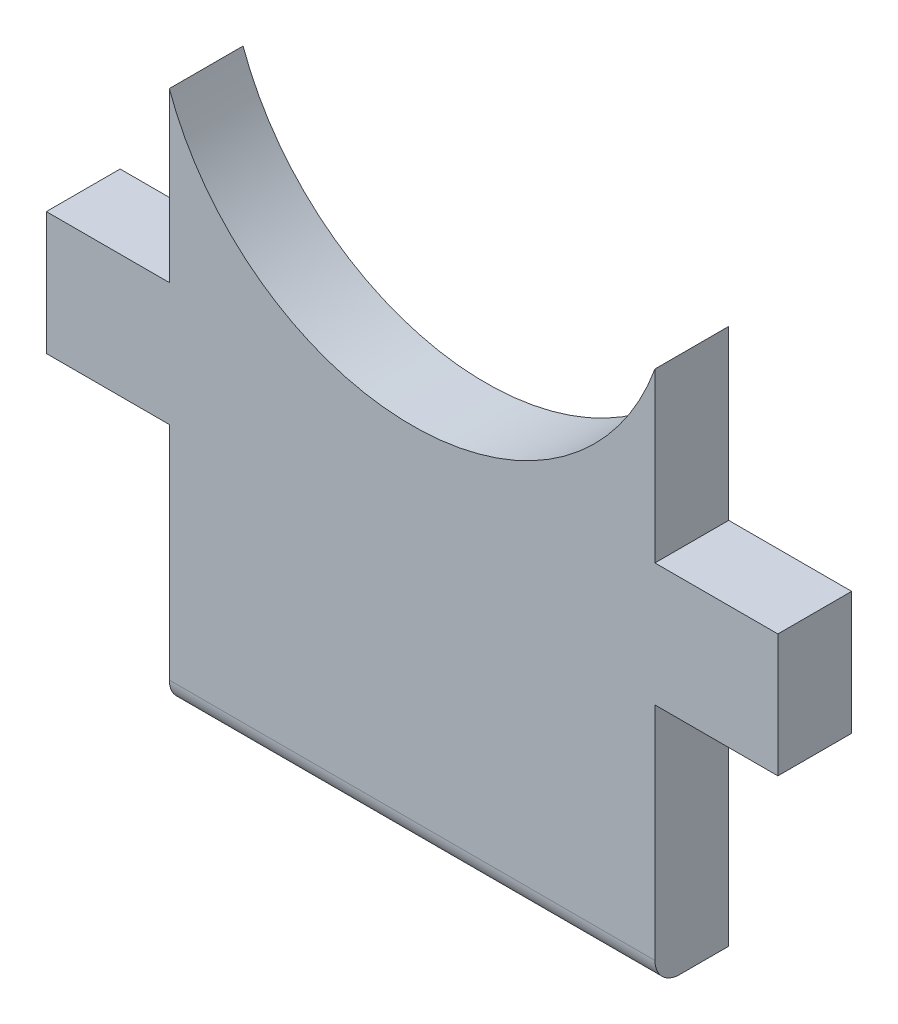
ISO-10303-21;
HEADER;
FILE_DESCRIPTION(('STEP AP214'),'2;1');
FILE_NAME('part.step','',(''),(''),'','','');
FILE_SCHEMA(('AUTOMOTIVE_DESIGN { 1 0 10303 214 1 1 1 1 }'));
ENDSEC;
DATA;
#1=APPLICATION_CONTEXT('core data for automotive mechanical design processes');
#2=APPLICATION_PROTOCOL_DEFINITION('international standard','automotive_design',2000,#1);
#3=PRODUCT_CONTEXT('',#1,'mechanical');
#4=PRODUCT('Part','Part','',(#3));
#5=PRODUCT_RELATED_PRODUCT_CATEGORY('part','',(#4));
#6=PRODUCT_DEFINITION_FORMATION('','',#4);
#7=PRODUCT_DEFINITION_CONTEXT('part definition',#1,'design');
#8=PRODUCT_DEFINITION('design','',#6,#7);
#9=PRODUCT_DEFINITION_SHAPE('','',#8);
#10=(LENGTH_UNIT() NAMED_UNIT(*) SI_UNIT(.MILLI.,.METRE.));
#11=(NAMED_UNIT(*) PLANE_ANGLE_UNIT() SI_UNIT($,.RADIAN.));
#12=(NAMED_UNIT(*) SI_UNIT($,.STERADIAN.) SOLID_ANGLE_UNIT());
#13=UNCERTAINTY_MEASURE_WITH_UNIT(LENGTH_MEASURE(1.E-05),#10,'distance_accuracy_value','');
#14=(GEOMETRIC_REPRESENTATION_CONTEXT(3) GLOBAL_UNCERTAINTY_ASSIGNED_CONTEXT((#13)) GLOBAL_UNIT_ASSIGNED_CONTEXT((#10,
#11,#12)) REPRESENTATION_CONTEXT('',''));
#15=CARTESIAN_POINT('',(0.,0.,0.));
#16=DIRECTION('',(0.,0.,1.));
#17=DIRECTION('',(1.,0.,0.));
#18=AXIS2_PLACEMENT_3D('',#15,#16,#17);
#19=CARTESIAN_POINT('',(-9.875,0.,3.));
#20=DIRECTION('',(1.,0.,0.));
#21=DIRECTION('',(0.,0.,-1.));
#22=AXIS2_PLACEMENT_3D('',#19,#20,#21);
#23=PLANE('',#22);
#24=DIRECTION('',(0.,-1.,0.));
#25=VECTOR('',#24,1.);
#26=CARTESIAN_POINT('',(-9.875,0.,3.));
#27=LINE('',#26,#25);
#28=CARTESIAN_POINT('',(-9.875,-3.56852560590505,3.));
#29=VERTEX_POINT('',#28);
#30=CARTESIAN_POINT('',(-9.875,-10.4,3.));
#31=VERTEX_POINT('',#30);
#32=EDGE_CURVE('E153',#29,#31,#27,.T.);
#33=ORIENTED_EDGE('',*,*,#32,.F.);
#34=DIRECTION('',(0.,0.,1.));
#35=VECTOR('',#34,1.);
#36=CARTESIAN_POINT('',(-9.875,-3.56852560590505,-7.));
#37=LINE('',#36,#35);
#38=CARTESIAN_POINT('',(-9.875,-3.56852560590505,0.));
#39=VERTEX_POINT('',#38);
#40=EDGE_CURVE('E140',#29,#39,#37,.F.);
#41=ORIENTED_EDGE('',*,*,#40,.T.);
#42=DIRECTION('',(0.,-1.,0.));
#43=VECTOR('',#42,1.);
#44=CARTESIAN_POINT('',(-9.875,0.,0.));
#45=LINE('',#44,#43);
#46=CARTESIAN_POINT('',(-9.875,-10.4,0.));
#47=VERTEX_POINT('',#46);
#48=EDGE_CURVE('E148',#39,#47,#45,.T.);
#49=ORIENTED_EDGE('',*,*,#48,.T.);
#50=DIRECTION('',(0.,0.,-1.));
#51=VECTOR('',#50,1.);
#52=CARTESIAN_POINT('',(-9.875,-10.4,3.));
#53=LINE('',#52,#51);
#54=EDGE_CURVE('E161',#31,#47,#53,.T.);
#55=ORIENTED_EDGE('',*,*,#54,.F.);
#56=EDGE_LOOP('',(#33,#41,#49,#55));
#57=FACE_BOUND('',#56,.T.);
#58=ADVANCED_FACE('F46',(#57),#23,.F.);
#59=CARTESIAN_POINT('',(0.,-10.4,3.));
#60=DIRECTION('',(0.,-1.,0.));
#61=DIRECTION('',(1.,0.,0.));
#62=AXIS2_PLACEMENT_3D('',#59,#60,#61);
#63=PLANE('',#62);
#64=DIRECTION('',(-1.,0.,0.));
#65=VECTOR('',#64,1.);
#66=CARTESIAN_POINT('',(0.,-10.4,0.));
#67=LINE('',#66,#65);
#68=CARTESIAN_POINT('',(-14.875,-10.4,0.));
#69=VERTEX_POINT('',#68);
#70=EDGE_CURVE('E206',#47,#69,#67,.T.);
#71=ORIENTED_EDGE('',*,*,#70,.T.);
#72=DIRECTION('',(0.,0.,-1.));
#73=VECTOR('',#72,1.);
#74=CARTESIAN_POINT('',(-14.875,-10.4,3.));
#75=LINE('',#74,#73);
#76=CARTESIAN_POINT('',(-14.875,-10.4,3.));
#77=VERTEX_POINT('',#76);
#78=EDGE_CURVE('E259',#77,#69,#75,.T.);
#79=ORIENTED_EDGE('',*,*,#78,.F.);
#80=DIRECTION('',(-1.,0.,0.));
#81=VECTOR('',#80,1.);
#82=CARTESIAN_POINT('',(0.,-10.4,3.));
#83=LINE('',#82,#81);
#84=EDGE_CURVE('E164',#31,#77,#83,.T.);
#85=ORIENTED_EDGE('',*,*,#84,.F.);
#86=ORIENTED_EDGE('',*,*,#54,.T.);
#87=EDGE_LOOP('',(#71,#79,#85,#86));
#88=FACE_BOUND('',#87,.T.);
#89=ADVANCED_FACE('F318',(#88),#63,.F.);
#90=CARTESIAN_POINT('',(-14.875,0.,3.));
#91=DIRECTION('',(1.,0.,0.));
#92=DIRECTION('',(0.,1.,0.));
#93=AXIS2_PLACEMENT_3D('',#90,#91,#92);
#94=PLANE('',#93);
#95=DIRECTION('',(0.,-1.,0.));
#96=VECTOR('',#95,1.);
#97=CARTESIAN_POINT('',(-14.875,0.,0.));
#98=LINE('',#97,#96);
#99=CARTESIAN_POINT('',(-14.875,-15.4,0.));
#100=VERTEX_POINT('',#99);
#101=EDGE_CURVE('E210',#69,#100,#98,.T.);
#102=ORIENTED_EDGE('',*,*,#101,.T.);
#103=DIRECTION('',(0.,0.,-1.));
#104=VECTOR('',#103,1.);
#105=CARTESIAN_POINT('',(-14.875,-15.4,3.));
#106=LINE('',#105,#104);
#107=CARTESIAN_POINT('',(-14.875,-15.4,3.));
#108=VERTEX_POINT('',#107);
#109=EDGE_CURVE('E256',#108,#100,#106,.T.);
#110=ORIENTED_EDGE('',*,*,#109,.F.);
#111=DIRECTION('',(0.,-1.,0.));
#112=VECTOR('',#111,1.);
#113=CARTESIAN_POINT('',(-14.875,0.,3.));
#114=LINE('',#113,#112);
#115=EDGE_CURVE('E170',#77,#108,#114,.T.);
#116=ORIENTED_EDGE('',*,*,#115,.F.);
#117=ORIENTED_EDGE('',*,*,#78,.T.);
#118=EDGE_LOOP('',(#102,#110,#116,#117));
#119=FACE_BOUND('',#118,.T.);
#120=ADVANCED_FACE('F322',(#119),#94,.F.);
#121=CARTESIAN_POINT('',(0.,-15.4,3.));
#122=DIRECTION('',(0.,-1.,0.));
#123=DIRECTION('',(1.,0.,0.));
#124=AXIS2_PLACEMENT_3D('',#121,#122,#123);
#125=PLANE('',#124);
#126=DIRECTION('',(-1.,0.,0.));
#127=VECTOR('',#126,1.);
#128=CARTESIAN_POINT('',(0.,-15.4,0.));
#129=LINE('',#128,#127);
#130=CARTESIAN_POINT('',(-9.875,-15.4,0.));
#131=VERTEX_POINT('',#130);
#132=EDGE_CURVE('E214',#131,#100,#129,.T.);
#133=ORIENTED_EDGE('',*,*,#132,.F.);
#134=DIRECTION('',(0.,0.,-1.));
#135=VECTOR('',#134,1.);
#136=CARTESIAN_POINT('',(-9.875,-15.4,3.));
#137=LINE('',#136,#135);
#138=CARTESIAN_POINT('',(-9.875,-15.4,3.));
#139=VERTEX_POINT('',#138);
#140=EDGE_CURVE('E253',#139,#131,#137,.T.);
#141=ORIENTED_EDGE('',*,*,#140,.F.);
#142=DIRECTION('',(-1.,0.,0.));
#143=VECTOR('',#142,1.);
#144=CARTESIAN_POINT('',(0.,-15.4,3.));
#145=LINE('',#144,#143);
#146=EDGE_CURVE('E179',#139,#108,#145,.T.);
#147=ORIENTED_EDGE('',*,*,#146,.T.);
#148=ORIENTED_EDGE('',*,*,#109,.T.);
#149=EDGE_LOOP('',(#133,#141,#147,#148));
#150=FACE_BOUND('',#149,.T.);
#151=ADVANCED_FACE('F314',(#150),#125,.T.);
#152=DIRECTION('',(0.,0.,-1.));
#153=VECTOR('',#152,1.);
#154=CARTESIAN_POINT('',(-9.875,-25.4,3.));
#155=LINE('',#154,#153);
#156=CARTESIAN_POINT('',(-9.875,-25.4,2.));
#157=VERTEX_POINT('',#156);
#158=CARTESIAN_POINT('',(-9.875,-25.4,0.));
#159=VERTEX_POINT('',#158);
#160=EDGE_CURVE('E250',#157,#159,#155,.T.);
#161=ORIENTED_EDGE('',*,*,#160,.F.);
#162=CARTESIAN_POINT('',(-9.875,-24.4,2.));
#163=DIRECTION('',(1.,0.,0.));
#164=DIRECTION('',(0.,0.,-1.));
#165=AXIS2_PLACEMENT_3D('',#162,#163,#164);
#166=CIRCLE('',#165,1.);
#167=CARTESIAN_POINT('',(-9.875,-24.4,3.));
#168=VERTEX_POINT('',#167);
#169=EDGE_CURVE('E55',#157,#168,#166,.F.);
#170=ORIENTED_EDGE('',*,*,#169,.T.);
#171=EDGE_CURVE('E167',#139,#168,#27,.T.);
#172=ORIENTED_EDGE('',*,*,#171,.F.);
#173=ORIENTED_EDGE('',*,*,#140,.T.);
#174=EDGE_CURVE('E207',#131,#159,#45,.T.);
#175=ORIENTED_EDGE('',*,*,#174,.T.);
#176=EDGE_LOOP('',(#161,#170,#172,#173,#175));
#177=FACE_BOUND('',#176,.T.);
#178=ADVANCED_FACE('F275',(#177),#23,.F.);
#179=CARTESIAN_POINT('',(0.,-25.4,3.));
#180=DIRECTION('',(0.,1.,0.));
#181=DIRECTION('',(0.,0.,1.));
#182=AXIS2_PLACEMENT_3D('',#179,#180,#181);
#183=PLANE('',#182);
#184=DIRECTION('',(0.,0.,-1.));
#185=VECTOR('',#184,1.);
#186=CARTESIAN_POINT('',(9.875,-25.4,3.));
#187=LINE('',#186,#185);
#188=CARTESIAN_POINT('',(9.875,-25.4,2.));
#189=VERTEX_POINT('',#188);
#190=CARTESIAN_POINT('',(9.875,-25.4,0.));
#191=VERTEX_POINT('',#190);
#192=EDGE_CURVE('E247',#189,#191,#187,.T.);
#193=ORIENTED_EDGE('',*,*,#192,.F.);
#194=DIRECTION('',(1.,0.,0.));
#195=VECTOR('',#194,1.);
#196=CARTESIAN_POINT('',(-9.875,-25.4,2.));
#197=LINE('',#196,#195);
#198=EDGE_CURVE('E69',#189,#157,#197,.F.);
#199=ORIENTED_EDGE('',*,*,#198,.T.);
#200=ORIENTED_EDGE('',*,*,#160,.T.);
#201=DIRECTION('',(1.,0.,0.));
#202=VECTOR('',#201,1.);
#203=CARTESIAN_POINT('',(0.,-25.4,0.));
#204=LINE('',#203,#202);
#205=EDGE_CURVE('E218',#159,#191,#204,.T.);
#206=ORIENTED_EDGE('',*,*,#205,.T.);
#207=EDGE_LOOP('',(#193,#199,#200,#206));
#208=FACE_BOUND('',#207,.T.);
#209=ADVANCED_FACE('F306',(#208),#183,.F.);
#210=CARTESIAN_POINT('',(9.875,0.,3.));
#211=DIRECTION('',(-1.,0.,0.));
#212=DIRECTION('',(0.,0.,1.));
#213=AXIS2_PLACEMENT_3D('',#210,#211,#212);
#214=PLANE('',#213);
#215=DIRECTION('',(0.,1.,0.));
#216=VECTOR('',#215,1.);
#217=CARTESIAN_POINT('',(9.875,0.,3.));
#218=LINE('',#217,#216);
#219=CARTESIAN_POINT('',(9.875,-24.4,3.));
#220=VERTEX_POINT('',#219);
#221=CARTESIAN_POINT('',(9.875,-15.4,3.));
#222=VERTEX_POINT('',#221);
#223=EDGE_CURVE('E178',#220,#222,#218,.T.);
#224=ORIENTED_EDGE('',*,*,#223,.F.);
#225=CARTESIAN_POINT('',(9.875,-24.4,2.));
#226=DIRECTION('',(-1.,0.,0.));
#227=DIRECTION('',(0.,0.,1.));
#228=AXIS2_PLACEMENT_3D('',#225,#226,#227);
#229=CIRCLE('',#228,1.);
#230=EDGE_CURVE('E268',#220,#189,#229,.F.);
#231=ORIENTED_EDGE('',*,*,#230,.T.);
#232=ORIENTED_EDGE('',*,*,#192,.T.);
#233=DIRECTION('',(0.,1.,0.));
#234=VECTOR('',#233,1.);
#235=CARTESIAN_POINT('',(9.875,0.,0.));
#236=LINE('',#235,#234);
#237=CARTESIAN_POINT('',(9.875,-15.4,0.));
#238=VERTEX_POINT('',#237);
#239=EDGE_CURVE('E175',#191,#238,#236,.T.);
#240=ORIENTED_EDGE('',*,*,#239,.T.);
#241=DIRECTION('',(0.,0.,-1.));
#242=VECTOR('',#241,1.);
#243=CARTESIAN_POINT('',(9.875,-15.4,3.));
#244=LINE('',#243,#242);
#245=EDGE_CURVE('E243',#222,#238,#244,.T.);
#246=ORIENTED_EDGE('',*,*,#245,.F.);
#247=EDGE_LOOP('',(#224,#231,#232,#240,#246));
#248=FACE_BOUND('',#247,.T.);
#249=ADVANCED_FACE('F281',(#248),#214,.F.);
#250=CARTESIAN_POINT('',(0.,-15.4,3.));
#251=DIRECTION('',(0.,1.,0.));
#252=DIRECTION('',(0.,0.,1.));
#253=AXIS2_PLACEMENT_3D('',#250,#251,#252);
#254=PLANE('',#253);
#255=DIRECTION('',(1.,0.,0.));
#256=VECTOR('',#255,1.);
#257=CARTESIAN_POINT('',(0.,-15.4,0.));
#258=LINE('',#257,#256);
#259=CARTESIAN_POINT('',(14.875,-15.4,0.));
#260=VERTEX_POINT('',#259);
#261=EDGE_CURVE('E223',#238,#260,#258,.T.);
#262=ORIENTED_EDGE('',*,*,#261,.T.);
#263=DIRECTION('',(0.,0.,-1.));
#264=VECTOR('',#263,1.);
#265=CARTESIAN_POINT('',(14.875,-15.4,3.));
#266=LINE('',#265,#264);
#267=CARTESIAN_POINT('',(14.875,-15.4,3.));
#268=VERTEX_POINT('',#267);
#269=EDGE_CURVE('E240',#268,#260,#266,.T.);
#270=ORIENTED_EDGE('',*,*,#269,.F.);
#271=DIRECTION('',(1.,0.,0.));
#272=VECTOR('',#271,1.);
#273=CARTESIAN_POINT('',(0.,-15.4,3.));
#274=LINE('',#273,#272);
#275=EDGE_CURVE('E186',#222,#268,#274,.T.);
#276=ORIENTED_EDGE('',*,*,#275,.F.);
#277=ORIENTED_EDGE('',*,*,#245,.T.);
#278=EDGE_LOOP('',(#262,#270,#276,#277));
#279=FACE_BOUND('',#278,.T.);
#280=ADVANCED_FACE('F287',(#279),#254,.F.);
#281=CARTESIAN_POINT('',(14.875,0.,3.));
#282=DIRECTION('',(1.,0.,0.));
#283=DIRECTION('',(0.,0.,-1.));
#284=AXIS2_PLACEMENT_3D('',#281,#282,#283);
#285=PLANE('',#284);
#286=DIRECTION('',(0.,-1.,0.));
#287=VECTOR('',#286,1.);
#288=CARTESIAN_POINT('',(14.875,0.,0.));
#289=LINE('',#288,#287);
#290=CARTESIAN_POINT('',(14.875,-10.4,0.));
#291=VERTEX_POINT('',#290);
#292=EDGE_CURVE('E227',#291,#260,#289,.T.);
#293=ORIENTED_EDGE('',*,*,#292,.F.);
#294=DIRECTION('',(0.,0.,-1.));
#295=VECTOR('',#294,1.);
#296=CARTESIAN_POINT('',(14.875,-10.4,3.));
#297=LINE('',#296,#295);
#298=CARTESIAN_POINT('',(14.875,-10.4,3.));
#299=VERTEX_POINT('',#298);
#300=EDGE_CURVE('E237',#299,#291,#297,.T.);
#301=ORIENTED_EDGE('',*,*,#300,.F.);
#302=DIRECTION('',(0.,-1.,0.));
#303=VECTOR('',#302,1.);
#304=CARTESIAN_POINT('',(14.875,0.,3.));
#305=LINE('',#304,#303);
#306=EDGE_CURVE('E196',#299,#268,#305,.T.);
#307=ORIENTED_EDGE('',*,*,#306,.T.);
#308=ORIENTED_EDGE('',*,*,#269,.T.);
#309=EDGE_LOOP('',(#293,#301,#307,#308));
#310=FACE_BOUND('',#309,.T.);
#311=ADVANCED_FACE('F336',(#310),#285,.T.);
#312=CARTESIAN_POINT('',(0.,-10.4,3.));
#313=DIRECTION('',(0.,1.,0.));
#314=DIRECTION('',(0.,0.,1.));
#315=AXIS2_PLACEMENT_3D('',#312,#313,#314);
#316=PLANE('',#315);
#317=DIRECTION('',(1.,0.,0.));
#318=VECTOR('',#317,1.);
#319=CARTESIAN_POINT('',(0.,-10.4,0.));
#320=LINE('',#319,#318);
#321=CARTESIAN_POINT('',(9.875,-10.4,0.));
#322=VERTEX_POINT('',#321);
#323=EDGE_CURVE('E173',#322,#291,#320,.T.);
#324=ORIENTED_EDGE('',*,*,#323,.F.);
#325=DIRECTION('',(0.,0.,-1.));
#326=VECTOR('',#325,1.);
#327=CARTESIAN_POINT('',(9.875,-10.4,3.));
#328=LINE('',#327,#326);
#329=CARTESIAN_POINT('',(9.875,-10.4,3.));
#330=VERTEX_POINT('',#329);
#331=EDGE_CURVE('E234',#330,#322,#328,.T.);
#332=ORIENTED_EDGE('',*,*,#331,.F.);
#333=DIRECTION('',(1.,0.,0.));
#334=VECTOR('',#333,1.);
#335=CARTESIAN_POINT('',(0.,-10.4,3.));
#336=LINE('',#335,#334);
#337=EDGE_CURVE('E200',#330,#299,#336,.T.);
#338=ORIENTED_EDGE('',*,*,#337,.T.);
#339=ORIENTED_EDGE('',*,*,#300,.T.);
#340=EDGE_LOOP('',(#324,#332,#338,#339));
#341=FACE_BOUND('',#340,.T.);
#342=ADVANCED_FACE('F292',(#341),#316,.T.);
#343=CARTESIAN_POINT('',(9.875,-3.56852560590505,0.));
#344=VERTEX_POINT('',#343);
#345=EDGE_CURVE('E165',#322,#344,#236,.T.);
#346=ORIENTED_EDGE('',*,*,#345,.T.);
#347=DIRECTION('',(0.,0.,1.));
#348=VECTOR('',#347,1.);
#349=CARTESIAN_POINT('',(9.875,-3.56852560590505,-7.));
#350=LINE('',#349,#348);
#351=CARTESIAN_POINT('',(9.875,-3.56852560590505,3.));
#352=VERTEX_POINT('',#351);
#353=EDGE_CURVE('E62',#344,#352,#350,.T.);
#354=ORIENTED_EDGE('',*,*,#353,.T.);
#355=EDGE_CURVE('E157',#330,#352,#218,.T.);
#356=ORIENTED_EDGE('',*,*,#355,.F.);
#357=ORIENTED_EDGE('',*,*,#331,.T.);
#358=EDGE_LOOP('',(#346,#354,#356,#357));
#359=FACE_BOUND('',#358,.T.);
#360=ADVANCED_FACE('F296',(#359),#214,.F.);
#361=CARTESIAN_POINT('',(0.,0.,3.));
#362=DIRECTION('',(0.,0.,1.));
#363=DIRECTION('',(1.,0.,0.));
#364=AXIS2_PLACEMENT_3D('',#361,#362,#363);
#365=PLANE('',#364);
#366=CARTESIAN_POINT('',(0.,0.,3.));
#367=DIRECTION('',(0.,0.,1.));
#368=DIRECTION('',(1.,0.,0.));
#369=AXIS2_PLACEMENT_3D('',#366,#367,#368);
#370=CIRCLE('',#369,10.5);
#371=EDGE_CURVE('E143',#29,#352,#370,.T.);
#372=ORIENTED_EDGE('',*,*,#371,.F.);
#373=ORIENTED_EDGE('',*,*,#32,.T.);
#374=ORIENTED_EDGE('',*,*,#84,.T.);
#375=ORIENTED_EDGE('',*,*,#115,.T.);
#376=ORIENTED_EDGE('',*,*,#146,.F.);
#377=ORIENTED_EDGE('',*,*,#171,.T.);
#378=DIRECTION('',(1.,0.,0.));
#379=VECTOR('',#378,1.);
#380=CARTESIAN_POINT('',(9.875,-24.4,3.));
#381=LINE('',#380,#379);
#382=EDGE_CURVE('E265',#168,#220,#381,.T.);
#383=ORIENTED_EDGE('',*,*,#382,.T.);
#384=ORIENTED_EDGE('',*,*,#223,.T.);
#385=ORIENTED_EDGE('',*,*,#275,.T.);
#386=ORIENTED_EDGE('',*,*,#306,.F.);
#387=ORIENTED_EDGE('',*,*,#337,.F.);
#388=ORIENTED_EDGE('',*,*,#355,.T.);
#389=EDGE_LOOP('',(#372,#373,#374,#375,#376,#377,#383,#384,#385,#386,#387,#388));
#390=FACE_BOUND('',#389,.T.);
#391=ADVANCED_FACE('F152',(#390),#365,.T.);
#392=CARTESIAN_POINT('',(0.,0.,0.));
#393=DIRECTION('',(0.,0.,1.));
#394=DIRECTION('',(1.,0.,0.));
#395=AXIS2_PLACEMENT_3D('',#392,#393,#394);
#396=PLANE('',#395);
#397=ORIENTED_EDGE('',*,*,#48,.F.);
#398=CARTESIAN_POINT('',(0.,0.,0.));
#399=DIRECTION('',(0.,0.,1.));
#400=DIRECTION('',(1.,0.,0.));
#401=AXIS2_PLACEMENT_3D('',#398,#399,#400);
#402=CIRCLE('',#401,10.5);
#403=EDGE_CURVE('E11',#39,#344,#402,.T.);
#404=ORIENTED_EDGE('',*,*,#403,.T.);
#405=ORIENTED_EDGE('',*,*,#345,.F.);
#406=ORIENTED_EDGE('',*,*,#323,.T.);
#407=ORIENTED_EDGE('',*,*,#292,.T.);
#408=ORIENTED_EDGE('',*,*,#261,.F.);
#409=ORIENTED_EDGE('',*,*,#239,.F.);
#410=ORIENTED_EDGE('',*,*,#205,.F.);
#411=ORIENTED_EDGE('',*,*,#174,.F.);
#412=ORIENTED_EDGE('',*,*,#132,.T.);
#413=ORIENTED_EDGE('',*,*,#101,.F.);
#414=ORIENTED_EDGE('',*,*,#70,.F.);
#415=EDGE_LOOP('',(#397,#404,#405,#406,#407,#408,#409,#410,#411,#412,#413,#414));
#416=FACE_BOUND('',#415,.T.);
#417=ADVANCED_FACE('F305',(#416),#396,.F.);
#418=CARTESIAN_POINT('',(0.,-24.4,2.));
#419=DIRECTION('',(-1.,0.,0.));
#420=DIRECTION('',(0.,0.,1.));
#421=AXIS2_PLACEMENT_3D('',#418,#419,#420);
#422=CYLINDRICAL_SURFACE('',#421,1.);
#423=ORIENTED_EDGE('',*,*,#169,.F.);
#424=ORIENTED_EDGE('',*,*,#198,.F.);
#425=ORIENTED_EDGE('',*,*,#230,.F.);
#426=ORIENTED_EDGE('',*,*,#382,.F.);
#427=EDGE_LOOP('',(#423,#424,#425,#426));
#428=FACE_BOUND('',#427,.T.);
#429=ADVANCED_FACE('F48',(#428),#422,.T.);
#430=CARTESIAN_POINT('',(0.,0.,-7.));
#431=DIRECTION('',(0.,0.,1.));
#432=DIRECTION('',(1.,0.,0.));
#433=AXIS2_PLACEMENT_3D('',#430,#431,#432);
#434=CYLINDRICAL_SURFACE('',#433,10.5);
#435=ORIENTED_EDGE('',*,*,#371,.T.);
#436=ORIENTED_EDGE('',*,*,#353,.F.);
#437=ORIENTED_EDGE('',*,*,#403,.F.);
#438=ORIENTED_EDGE('',*,*,#40,.F.);
#439=EDGE_LOOP('',(#435,#436,#437,#438));
#440=FACE_BOUND('',#439,.T.);
#441=ADVANCED_FACE('F142',(#440),#434,.F.);
#442=CLOSED_SHELL('',(#58,#89,#120,#151,#178,#209,#249,#280,#311,#342,#360,#391,#417,#429,#441));
#443=MANIFOLD_SOLID_BREP('B2',#442);
#444=ADVANCED_BREP_SHAPE_REPRESENTATION('',(#18,#443),#14);
#445=SHAPE_DEFINITION_REPRESENTATION(#9,#444);
ENDSEC;
END-ISO-10303-21;
